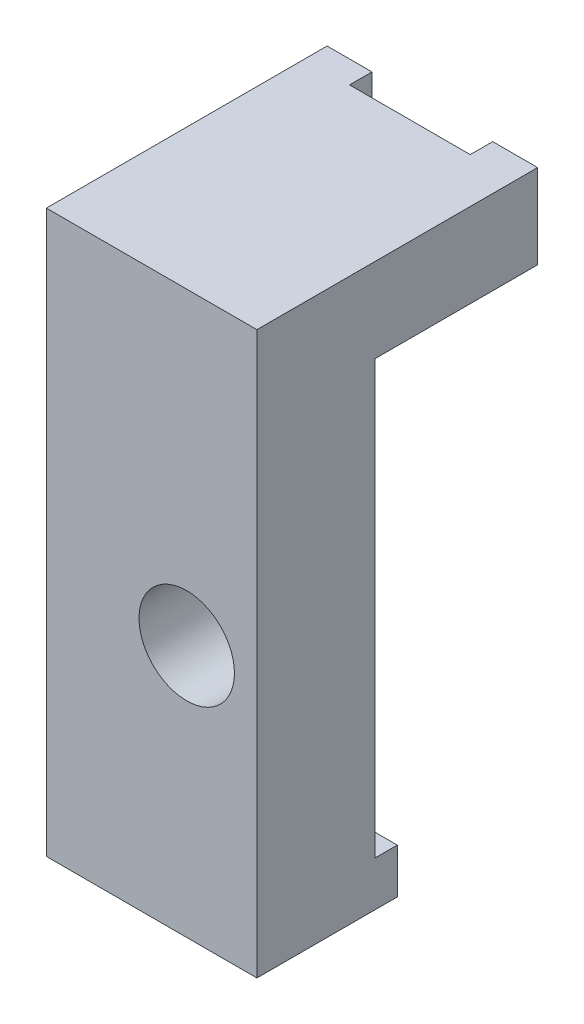
ISO-10303-21;
HEADER;
FILE_DESCRIPTION(('STEP AP214'),'2;1');
FILE_NAME('part.step','',(''),(''),'','','');
FILE_SCHEMA(('AUTOMOTIVE_DESIGN { 1 0 10303 214 1 1 1 1 }'));
ENDSEC;
DATA;
#1=APPLICATION_CONTEXT('core data for automotive mechanical design processes');
#2=APPLICATION_PROTOCOL_DEFINITION('international standard','automotive_design',2000,#1);
#3=PRODUCT_CONTEXT('',#1,'mechanical');
#4=PRODUCT('Part','Part','',(#3));
#5=PRODUCT_RELATED_PRODUCT_CATEGORY('part','',(#4));
#6=PRODUCT_DEFINITION_FORMATION('','',#4);
#7=PRODUCT_DEFINITION_CONTEXT('part definition',#1,'design');
#8=PRODUCT_DEFINITION('design','',#6,#7);
#9=PRODUCT_DEFINITION_SHAPE('','',#8);
#10=(LENGTH_UNIT() NAMED_UNIT(*) SI_UNIT(.MILLI.,.METRE.));
#11=(NAMED_UNIT(*) PLANE_ANGLE_UNIT() SI_UNIT($,.RADIAN.));
#12=(NAMED_UNIT(*) SI_UNIT($,.STERADIAN.) SOLID_ANGLE_UNIT());
#13=UNCERTAINTY_MEASURE_WITH_UNIT(LENGTH_MEASURE(1.E-05),#10,'distance_accuracy_value','');
#14=(GEOMETRIC_REPRESENTATION_CONTEXT(3) GLOBAL_UNCERTAINTY_ASSIGNED_CONTEXT((#13)) GLOBAL_UNIT_ASSIGNED_CONTEXT((#10,
#11,#12)) REPRESENTATION_CONTEXT('',''));
#15=CARTESIAN_POINT('',(0.,0.,0.));
#16=DIRECTION('',(0.,0.,1.));
#17=DIRECTION('',(1.,0.,0.));
#18=AXIS2_PLACEMENT_3D('',#15,#16,#17);
#19=CARTESIAN_POINT('',(0.,0.,-6.35));
#20=DIRECTION('',(0.,0.,1.));
#21=DIRECTION('',(1.,0.,0.));
#22=AXIS2_PLACEMENT_3D('',#19,#20,#21);
#23=PLANE('',#22);
#24=DIRECTION('',(1.,0.,0.));
#25=VECTOR('',#24,1.);
#26=CARTESIAN_POINT('',(-4.76350000000001,8.89,-6.35));
#27=LINE('',#26,#25);
#28=CARTESIAN_POINT('',(2.7305,8.89,-6.35));
#29=VERTEX_POINT('',#28);
#30=CARTESIAN_POINT('',(4.7625,8.89,-6.35));
#31=VERTEX_POINT('',#30);
#32=EDGE_CURVE('E219',#29,#31,#27,.T.);
#33=ORIENTED_EDGE('',*,*,#32,.F.);
#34=DIRECTION('',(0.,1.,0.));
#35=VECTOR('',#34,1.);
#36=CARTESIAN_POINT('',(2.7305,-12.701,-6.35));
#37=LINE('',#36,#35);
#38=CARTESIAN_POINT('',(2.7305,12.7,-6.35));
#39=VERTEX_POINT('',#38);
#40=EDGE_CURVE('E193',#29,#39,#37,.T.);
#41=ORIENTED_EDGE('',*,*,#40,.T.);
#42=DIRECTION('',(-1.,0.,0.));
#43=VECTOR('',#42,1.);
#44=CARTESIAN_POINT('',(-4.7625,12.7,-6.35));
#45=LINE('',#44,#43);
#46=CARTESIAN_POINT('',(4.7625,12.7,-6.35));
#47=VERTEX_POINT('',#46);
#48=EDGE_CURVE('E242',#47,#39,#45,.T.);
#49=ORIENTED_EDGE('',*,*,#48,.F.);
#50=DIRECTION('',(0.,1.,0.));
#51=VECTOR('',#50,1.);
#52=CARTESIAN_POINT('',(4.7625,12.7,-6.35));
#53=LINE('',#52,#51);
#54=EDGE_CURVE('E136',#31,#47,#53,.T.);
#55=ORIENTED_EDGE('',*,*,#54,.F.);
#56=EDGE_LOOP('',(#33,#41,#49,#55));
#57=FACE_BOUND('',#56,.T.);
#58=ADVANCED_FACE('F36',(#57),#23,.F.);
#59=CARTESIAN_POINT('',(4.7625,12.7,6.35));
#60=DIRECTION('',(-1.,0.,0.));
#61=DIRECTION('',(0.,-1.,0.));
#62=AXIS2_PLACEMENT_3D('',#59,#60,#61);
#63=PLANE('',#62);
#64=DIRECTION('',(0.,-1.,0.));
#65=VECTOR('',#64,1.);
#66=CARTESIAN_POINT('',(4.7625,-12.7,0.));
#67=LINE('',#66,#65);
#68=CARTESIAN_POINT('',(4.7625,-10.668,0.));
#69=VERTEX_POINT('',#68);
#70=CARTESIAN_POINT('',(4.7625,-12.7,0.));
#71=VERTEX_POINT('',#70);
#72=EDGE_CURVE('E216',#69,#71,#67,.T.);
#73=ORIENTED_EDGE('',*,*,#72,.F.);
#74=DIRECTION('',(0.,0.,-1.));
#75=VECTOR('',#74,1.);
#76=CARTESIAN_POINT('',(4.7625,-10.668,0.));
#77=LINE('',#76,#75);
#78=CARTESIAN_POINT('',(4.7625,-10.668,1.016));
#79=VERTEX_POINT('',#78);
#80=EDGE_CURVE('E155',#79,#69,#77,.T.);
#81=ORIENTED_EDGE('',*,*,#80,.F.);
#82=DIRECTION('',(0.,-1.,0.));
#83=VECTOR('',#82,1.);
#84=CARTESIAN_POINT('',(4.7625,-10.668,1.016));
#85=LINE('',#84,#83);
#86=CARTESIAN_POINT('',(4.7625,8.89,1.016));
#87=VERTEX_POINT('',#86);
#88=EDGE_CURVE('E162',#87,#79,#85,.T.);
#89=ORIENTED_EDGE('',*,*,#88,.F.);
#90=DIRECTION('',(0.,0.,1.));
#91=VECTOR('',#90,1.);
#92=CARTESIAN_POINT('',(4.7625,8.89,-6.35));
#93=LINE('',#92,#91);
#94=EDGE_CURVE('E143',#31,#87,#93,.T.);
#95=ORIENTED_EDGE('',*,*,#94,.F.);
#96=ORIENTED_EDGE('',*,*,#54,.T.);
#97=DIRECTION('',(0.,0.,-1.));
#98=VECTOR('',#97,1.);
#99=CARTESIAN_POINT('',(4.7625,12.7,6.35));
#100=LINE('',#99,#98);
#101=CARTESIAN_POINT('',(4.7625,12.7,6.35));
#102=VERTEX_POINT('',#101);
#103=EDGE_CURVE('E11',#102,#47,#100,.T.);
#104=ORIENTED_EDGE('',*,*,#103,.F.);
#105=DIRECTION('',(0.,1.,0.));
#106=VECTOR('',#105,1.);
#107=CARTESIAN_POINT('',(4.7625,12.7,6.35));
#108=LINE('',#107,#106);
#109=CARTESIAN_POINT('',(4.7625,-12.7,6.35));
#110=VERTEX_POINT('',#109);
#111=EDGE_CURVE('E225',#110,#102,#108,.T.);
#112=ORIENTED_EDGE('',*,*,#111,.F.);
#113=DIRECTION('',(0.,0.,-1.));
#114=VECTOR('',#113,1.);
#115=CARTESIAN_POINT('',(4.7625,-12.7,6.35));
#116=LINE('',#115,#114);
#117=EDGE_CURVE('E238',#110,#71,#116,.T.);
#118=ORIENTED_EDGE('',*,*,#117,.T.);
#119=EDGE_LOOP('',(#73,#81,#89,#95,#96,#104,#112,#118));
#120=FACE_BOUND('',#119,.T.);
#121=ADVANCED_FACE('F38',(#120),#63,.F.);
#122=CARTESIAN_POINT('',(-4.7625,12.7,6.35));
#123=DIRECTION('',(0.,-1.,0.));
#124=DIRECTION('',(0.,0.,-1.));
#125=AXIS2_PLACEMENT_3D('',#122,#123,#124);
#126=PLANE('',#125);
#127=ORIENTED_EDGE('',*,*,#48,.T.);
#128=DIRECTION('',(0.,0.,-1.));
#129=VECTOR('',#128,1.);
#130=CARTESIAN_POINT('',(2.7305,12.7,-6.35));
#131=LINE('',#130,#129);
#132=CARTESIAN_POINT('',(2.7305,12.7,-5.334));
#133=VERTEX_POINT('',#132);
#134=EDGE_CURVE('E182',#133,#39,#131,.T.);
#135=ORIENTED_EDGE('',*,*,#134,.F.);
#136=DIRECTION('',(1.,0.,0.));
#137=VECTOR('',#136,1.);
#138=CARTESIAN_POINT('',(2.7305,12.7,-5.334));
#139=LINE('',#138,#137);
#140=CARTESIAN_POINT('',(-2.7305,12.7,-5.334));
#141=VERTEX_POINT('',#140);
#142=EDGE_CURVE('E189',#141,#133,#139,.T.);
#143=ORIENTED_EDGE('',*,*,#142,.F.);
#144=DIRECTION('',(0.,0.,1.));
#145=VECTOR('',#144,1.);
#146=CARTESIAN_POINT('',(-2.7305,12.7,-6.35));
#147=LINE('',#146,#145);
#148=CARTESIAN_POINT('',(-2.7305,12.7,-6.35));
#149=VERTEX_POINT('',#148);
#150=EDGE_CURVE('E185',#149,#141,#147,.T.);
#151=ORIENTED_EDGE('',*,*,#150,.F.);
#152=CARTESIAN_POINT('',(-4.7625,12.7,-6.35));
#153=VERTEX_POINT('',#152);
#154=EDGE_CURVE('E241',#149,#153,#45,.T.);
#155=ORIENTED_EDGE('',*,*,#154,.T.);
#156=DIRECTION('',(0.,0.,-1.));
#157=VECTOR('',#156,1.);
#158=CARTESIAN_POINT('',(-4.7625,12.7,6.35));
#159=LINE('',#158,#157);
#160=CARTESIAN_POINT('',(-4.7625,12.7,6.35));
#161=VERTEX_POINT('',#160);
#162=EDGE_CURVE('E46',#161,#153,#159,.T.);
#163=ORIENTED_EDGE('',*,*,#162,.F.);
#164=DIRECTION('',(-1.,0.,0.));
#165=VECTOR('',#164,1.);
#166=CARTESIAN_POINT('',(-4.7625,12.7,6.35));
#167=LINE('',#166,#165);
#168=EDGE_CURVE('E229',#102,#161,#167,.T.);
#169=ORIENTED_EDGE('',*,*,#168,.F.);
#170=ORIENTED_EDGE('',*,*,#103,.T.);
#171=EDGE_LOOP('',(#127,#135,#143,#151,#155,#163,#169,#170));
#172=FACE_BOUND('',#171,.T.);
#173=ADVANCED_FACE('F271',(#172),#126,.F.);
#174=CARTESIAN_POINT('',(-4.7625,12.7,6.35));
#175=DIRECTION('',(1.,0.,0.));
#176=DIRECTION('',(0.,1.,0.));
#177=AXIS2_PLACEMENT_3D('',#174,#175,#176);
#178=PLANE('',#177);
#179=DIRECTION('',(0.,-1.,0.));
#180=VECTOR('',#179,1.);
#181=CARTESIAN_POINT('',(-4.7625,-10.668,1.016));
#182=LINE('',#181,#180);
#183=CARTESIAN_POINT('',(-4.76250000000001,8.89,1.016));
#184=VERTEX_POINT('',#183);
#185=CARTESIAN_POINT('',(-4.7625,-10.668,1.016));
#186=VERTEX_POINT('',#185);
#187=EDGE_CURVE('E131',#184,#186,#182,.T.);
#188=ORIENTED_EDGE('',*,*,#187,.T.);
#189=DIRECTION('',(0.,0.,-1.));
#190=VECTOR('',#189,1.);
#191=CARTESIAN_POINT('',(-4.7625,-10.668,0.));
#192=LINE('',#191,#190);
#193=CARTESIAN_POINT('',(-4.7625,-10.668,0.));
#194=VERTEX_POINT('',#193);
#195=EDGE_CURVE('E149',#186,#194,#192,.T.);
#196=ORIENTED_EDGE('',*,*,#195,.T.);
#197=DIRECTION('',(0.,1.,0.));
#198=VECTOR('',#197,1.);
#199=CARTESIAN_POINT('',(-4.7625,-12.7,0.));
#200=LINE('',#199,#198);
#201=CARTESIAN_POINT('',(-4.7625,-12.7,0.));
#202=VERTEX_POINT('',#201);
#203=EDGE_CURVE('E210',#202,#194,#200,.T.);
#204=ORIENTED_EDGE('',*,*,#203,.F.);
#205=DIRECTION('',(0.,0.,-1.));
#206=VECTOR('',#205,1.);
#207=CARTESIAN_POINT('',(-4.7625,-12.7,6.35));
#208=LINE('',#207,#206);
#209=CARTESIAN_POINT('',(-4.7625,-12.7,6.35));
#210=VERTEX_POINT('',#209);
#211=EDGE_CURVE('E250',#210,#202,#208,.T.);
#212=ORIENTED_EDGE('',*,*,#211,.F.);
#213=DIRECTION('',(0.,-1.,0.));
#214=VECTOR('',#213,1.);
#215=CARTESIAN_POINT('',(-4.7625,12.7,6.35));
#216=LINE('',#215,#214);
#217=EDGE_CURVE('E232',#161,#210,#216,.T.);
#218=ORIENTED_EDGE('',*,*,#217,.F.);
#219=ORIENTED_EDGE('',*,*,#162,.T.);
#220=DIRECTION('',(0.,-1.,0.));
#221=VECTOR('',#220,1.);
#222=CARTESIAN_POINT('',(-4.7625,12.7,-6.35));
#223=LINE('',#222,#221);
#224=CARTESIAN_POINT('',(-4.7625,8.89,-6.35));
#225=VERTEX_POINT('',#224);
#226=EDGE_CURVE('E134',#153,#225,#223,.T.);
#227=ORIENTED_EDGE('',*,*,#226,.T.);
#228=DIRECTION('',(0.,0.,-1.));
#229=VECTOR('',#228,1.);
#230=CARTESIAN_POINT('',(-4.7625,8.89,-6.35));
#231=LINE('',#230,#229);
#232=EDGE_CURVE('E61',#184,#225,#231,.T.);
#233=ORIENTED_EDGE('',*,*,#232,.F.);
#234=EDGE_LOOP('',(#188,#196,#204,#212,#218,#219,#227,#233));
#235=FACE_BOUND('',#234,.T.);
#236=ADVANCED_FACE('F128',(#235),#178,.F.);
#237=CARTESIAN_POINT('',(-4.7625,-12.7,6.35));
#238=DIRECTION('',(0.,1.,0.));
#239=DIRECTION('',(0.,0.,1.));
#240=AXIS2_PLACEMENT_3D('',#237,#238,#239);
#241=PLANE('',#240);
#242=ORIENTED_EDGE('',*,*,#211,.T.);
#243=DIRECTION('',(1.,0.,0.));
#244=VECTOR('',#243,1.);
#245=CARTESIAN_POINT('',(-4.7635,-12.7,0.));
#246=LINE('',#245,#244);
#247=EDGE_CURVE('E137',#202,#71,#246,.T.);
#248=ORIENTED_EDGE('',*,*,#247,.T.);
#249=ORIENTED_EDGE('',*,*,#117,.F.);
#250=DIRECTION('',(1.,0.,0.));
#251=VECTOR('',#250,1.);
#252=CARTESIAN_POINT('',(-4.7625,-12.7,6.35));
#253=LINE('',#252,#251);
#254=EDGE_CURVE('E235',#210,#110,#253,.T.);
#255=ORIENTED_EDGE('',*,*,#254,.F.);
#256=EDGE_LOOP('',(#242,#248,#249,#255));
#257=FACE_BOUND('',#256,.T.);
#258=ADVANCED_FACE('F291',(#257),#241,.F.);
#259=CARTESIAN_POINT('',(0.,0.,6.35));
#260=DIRECTION('',(0.,0.,1.));
#261=DIRECTION('',(1.,0.,0.));
#262=AXIS2_PLACEMENT_3D('',#259,#260,#261);
#263=PLANE('',#262);
#264=CARTESIAN_POINT('',(1.5875,-1.27,6.35));
#265=DIRECTION('',(0.,0.,1.));
#266=DIRECTION('',(1.,0.,0.));
#267=AXIS2_PLACEMENT_3D('',#264,#265,#266);
#268=CIRCLE('',#267,2.159);
#269=CARTESIAN_POINT('',(3.7465,-1.27,6.35));
#270=VERTEX_POINT('',#269);
#271=EDGE_CURVE('E197',#270,#270,#268,.T.);
#272=ORIENTED_EDGE('',*,*,#271,.F.);
#273=EDGE_LOOP('',(#272));
#274=FACE_BOUND('',#273,.T.);
#275=ORIENTED_EDGE('',*,*,#111,.T.);
#276=ORIENTED_EDGE('',*,*,#168,.T.);
#277=ORIENTED_EDGE('',*,*,#217,.T.);
#278=ORIENTED_EDGE('',*,*,#254,.T.);
#279=EDGE_LOOP('',(#275,#276,#277,#278));
#280=FACE_BOUND('',#279,.T.);
#281=ADVANCED_FACE('F295',(#274,#280),#263,.T.);
#282=ORIENTED_EDGE('',*,*,#154,.F.);
#283=DIRECTION('',(0.,1.,0.));
#284=VECTOR('',#283,1.);
#285=CARTESIAN_POINT('',(-2.7305,-12.701,-6.35));
#286=LINE('',#285,#284);
#287=CARTESIAN_POINT('',(-2.7305,8.88999999999999,-6.35));
#288=VERTEX_POINT('',#287);
#289=EDGE_CURVE('E201',#288,#149,#286,.T.);
#290=ORIENTED_EDGE('',*,*,#289,.F.);
#291=EDGE_CURVE('E223',#225,#288,#27,.T.);
#292=ORIENTED_EDGE('',*,*,#291,.F.);
#293=ORIENTED_EDGE('',*,*,#226,.F.);
#294=EDGE_LOOP('',(#282,#290,#292,#293));
#295=FACE_BOUND('',#294,.T.);
#296=ADVANCED_FACE('F261',(#295),#23,.F.);
#297=CARTESIAN_POINT('',(-4.7635,-12.7,0.));
#298=DIRECTION('',(0.,0.,1.));
#299=DIRECTION('',(1.,0.,0.));
#300=AXIS2_PLACEMENT_3D('',#297,#298,#299);
#301=PLANE('',#300);
#302=ORIENTED_EDGE('',*,*,#203,.T.);
#303=DIRECTION('',(1.,0.,0.));
#304=VECTOR('',#303,1.);
#305=CARTESIAN_POINT('',(-4.7625,-10.668,0.));
#306=LINE('',#305,#304);
#307=EDGE_CURVE('E167',#194,#69,#306,.T.);
#308=ORIENTED_EDGE('',*,*,#307,.T.);
#309=ORIENTED_EDGE('',*,*,#72,.T.);
#310=ORIENTED_EDGE('',*,*,#247,.F.);
#311=EDGE_LOOP('',(#302,#308,#309,#310));
#312=FACE_BOUND('',#311,.T.);
#313=ADVANCED_FACE('F287',(#312),#301,.F.);
#314=CARTESIAN_POINT('',(-4.76350000000001,8.89,-6.35));
#315=DIRECTION('',(0.,1.,0.));
#316=DIRECTION('',(0.,0.,1.));
#317=AXIS2_PLACEMENT_3D('',#314,#315,#316);
#318=PLANE('',#317);
#319=DIRECTION('',(-1.,0.,0.));
#320=VECTOR('',#319,1.);
#321=CARTESIAN_POINT('',(2.73049999999999,8.89,-5.334));
#322=LINE('',#321,#320);
#323=CARTESIAN_POINT('',(2.7305,8.88999999999999,-5.334));
#324=VERTEX_POINT('',#323);
#325=CARTESIAN_POINT('',(-2.7305,8.89,-5.334));
#326=VERTEX_POINT('',#325);
#327=EDGE_CURVE('E53',#324,#326,#322,.T.);
#328=ORIENTED_EDGE('',*,*,#327,.F.);
#329=DIRECTION('',(0.,0.,1.));
#330=VECTOR('',#329,1.);
#331=CARTESIAN_POINT('',(2.7305,8.89,-6.34999999999999));
#332=LINE('',#331,#330);
#333=EDGE_CURVE('E178',#29,#324,#332,.T.);
#334=ORIENTED_EDGE('',*,*,#333,.F.);
#335=ORIENTED_EDGE('',*,*,#32,.T.);
#336=ORIENTED_EDGE('',*,*,#94,.T.);
#337=DIRECTION('',(1.,0.,0.));
#338=VECTOR('',#337,1.);
#339=CARTESIAN_POINT('',(-4.76250000000001,8.89,1.016));
#340=LINE('',#339,#338);
#341=EDGE_CURVE('E140',#184,#87,#340,.T.);
#342=ORIENTED_EDGE('',*,*,#341,.F.);
#343=ORIENTED_EDGE('',*,*,#232,.T.);
#344=ORIENTED_EDGE('',*,*,#291,.T.);
#345=DIRECTION('',(0.,0.,-1.));
#346=VECTOR('',#345,1.);
#347=CARTESIAN_POINT('',(-2.7305,8.89,-6.34999999999999));
#348=LINE('',#347,#346);
#349=EDGE_CURVE('E173',#326,#288,#348,.T.);
#350=ORIENTED_EDGE('',*,*,#349,.F.);
#351=EDGE_LOOP('',(#328,#334,#335,#336,#342,#343,#344,#350));
#352=FACE_BOUND('',#351,.T.);
#353=ADVANCED_FACE('F141',(#352),#318,.F.);
#354=CARTESIAN_POINT('',(1.5875,-1.27,-6.351));
#355=DIRECTION('',(0.,0.,1.));
#356=DIRECTION('',(1.,0.,0.));
#357=AXIS2_PLACEMENT_3D('',#354,#355,#356);
#358=CYLINDRICAL_SURFACE('',#357,2.159);
#359=CARTESIAN_POINT('',(1.5875,-1.27,1.016));
#360=DIRECTION('',(0.,0.,1.));
#361=DIRECTION('',(1.,0.,0.));
#362=AXIS2_PLACEMENT_3D('',#359,#360,#361);
#363=CIRCLE('',#362,2.159);
#364=CARTESIAN_POINT('',(3.7465,-1.27,1.016));
#365=VERTEX_POINT('',#364);
#366=EDGE_CURVE('E40',#365,#365,#363,.F.);
#367=ORIENTED_EDGE('',*,*,#366,.T.);
#368=EDGE_LOOP('',(#367));
#369=FACE_BOUND('',#368,.T.);
#370=ORIENTED_EDGE('',*,*,#271,.T.);
#371=EDGE_LOOP('',(#370));
#372=FACE_BOUND('',#371,.T.);
#373=ADVANCED_FACE('F348',(#369,#372),#358,.F.);
#374=CARTESIAN_POINT('',(2.7305,-12.701,-6.35));
#375=DIRECTION('',(1.,0.,0.));
#376=DIRECTION('',(0.,0.,-1.));
#377=AXIS2_PLACEMENT_3D('',#374,#375,#376);
#378=PLANE('',#377);
#379=ORIENTED_EDGE('',*,*,#333,.T.);
#380=DIRECTION('',(0.,1.,0.));
#381=VECTOR('',#380,1.);
#382=CARTESIAN_POINT('',(2.7305,-12.701,-5.334));
#383=LINE('',#382,#381);
#384=EDGE_CURVE('E194',#324,#133,#383,.T.);
#385=ORIENTED_EDGE('',*,*,#384,.T.);
#386=ORIENTED_EDGE('',*,*,#134,.T.);
#387=ORIENTED_EDGE('',*,*,#40,.F.);
#388=EDGE_LOOP('',(#379,#385,#386,#387));
#389=FACE_BOUND('',#388,.T.);
#390=ADVANCED_FACE('F274',(#389),#378,.F.);
#391=CARTESIAN_POINT('',(2.7305,-12.701,-5.334));
#392=DIRECTION('',(0.,0.,1.));
#393=DIRECTION('',(1.,0.,0.));
#394=AXIS2_PLACEMENT_3D('',#391,#392,#393);
#395=PLANE('',#394);
#396=ORIENTED_EDGE('',*,*,#327,.T.);
#397=DIRECTION('',(0.,1.,0.));
#398=VECTOR('',#397,1.);
#399=CARTESIAN_POINT('',(-2.7305,-12.701,-5.334));
#400=LINE('',#399,#398);
#401=EDGE_CURVE('E198',#326,#141,#400,.T.);
#402=ORIENTED_EDGE('',*,*,#401,.T.);
#403=ORIENTED_EDGE('',*,*,#142,.T.);
#404=ORIENTED_EDGE('',*,*,#384,.F.);
#405=EDGE_LOOP('',(#396,#402,#403,#404));
#406=FACE_BOUND('',#405,.T.);
#407=ADVANCED_FACE('F269',(#406),#395,.F.);
#408=CARTESIAN_POINT('',(-2.7305,-12.701,-6.35));
#409=DIRECTION('',(-1.,0.,0.));
#410=DIRECTION('',(0.,0.,1.));
#411=AXIS2_PLACEMENT_3D('',#408,#409,#410);
#412=PLANE('',#411);
#413=ORIENTED_EDGE('',*,*,#349,.T.);
#414=ORIENTED_EDGE('',*,*,#289,.T.);
#415=ORIENTED_EDGE('',*,*,#150,.T.);
#416=ORIENTED_EDGE('',*,*,#401,.F.);
#417=EDGE_LOOP('',(#413,#414,#415,#416));
#418=FACE_BOUND('',#417,.T.);
#419=ADVANCED_FACE('F266',(#418),#412,.F.);
#420=CARTESIAN_POINT('',(-4.7625,-10.668,1.016));
#421=DIRECTION('',(0.,0.,1.));
#422=DIRECTION('',(1.,0.,0.));
#423=AXIS2_PLACEMENT_3D('',#420,#421,#422);
#424=PLANE('',#423);
#425=ORIENTED_EDGE('',*,*,#88,.T.);
#426=DIRECTION('',(1.,0.,0.));
#427=VECTOR('',#426,1.);
#428=CARTESIAN_POINT('',(-4.7625,-10.668,1.016));
#429=LINE('',#428,#427);
#430=EDGE_CURVE('E148',#186,#79,#429,.T.);
#431=ORIENTED_EDGE('',*,*,#430,.F.);
#432=ORIENTED_EDGE('',*,*,#187,.F.);
#433=ORIENTED_EDGE('',*,*,#341,.T.);
#434=EDGE_LOOP('',(#425,#431,#432,#433));
#435=FACE_BOUND('',#434,.T.);
#436=ORIENTED_EDGE('',*,*,#366,.F.);
#437=EDGE_LOOP('',(#436));
#438=FACE_BOUND('',#437,.T.);
#439=ADVANCED_FACE('F151',(#435,#438),#424,.F.);
#440=CARTESIAN_POINT('',(-4.7625,-10.668,0.));
#441=DIRECTION('',(0.,-1.,0.));
#442=DIRECTION('',(1.,0.,0.));
#443=AXIS2_PLACEMENT_3D('',#440,#441,#442);
#444=PLANE('',#443);
#445=ORIENTED_EDGE('',*,*,#80,.T.);
#446=ORIENTED_EDGE('',*,*,#307,.F.);
#447=ORIENTED_EDGE('',*,*,#195,.F.);
#448=ORIENTED_EDGE('',*,*,#430,.T.);
#449=EDGE_LOOP('',(#445,#446,#447,#448));
#450=FACE_BOUND('',#449,.T.);
#451=ADVANCED_FACE('F285',(#450),#444,.F.);
#452=CLOSED_SHELL('',(#58,#121,#173,#236,#258,#281,#296,#313,#353,#373,#390,#407,#419,#439,#451));
#453=MANIFOLD_SOLID_BREP('B2',#452);
#454=ADVANCED_BREP_SHAPE_REPRESENTATION('',(#18,#453),#14);
#455=SHAPE_DEFINITION_REPRESENTATION(#9,#454);
ENDSEC;
END-ISO-10303-21;
